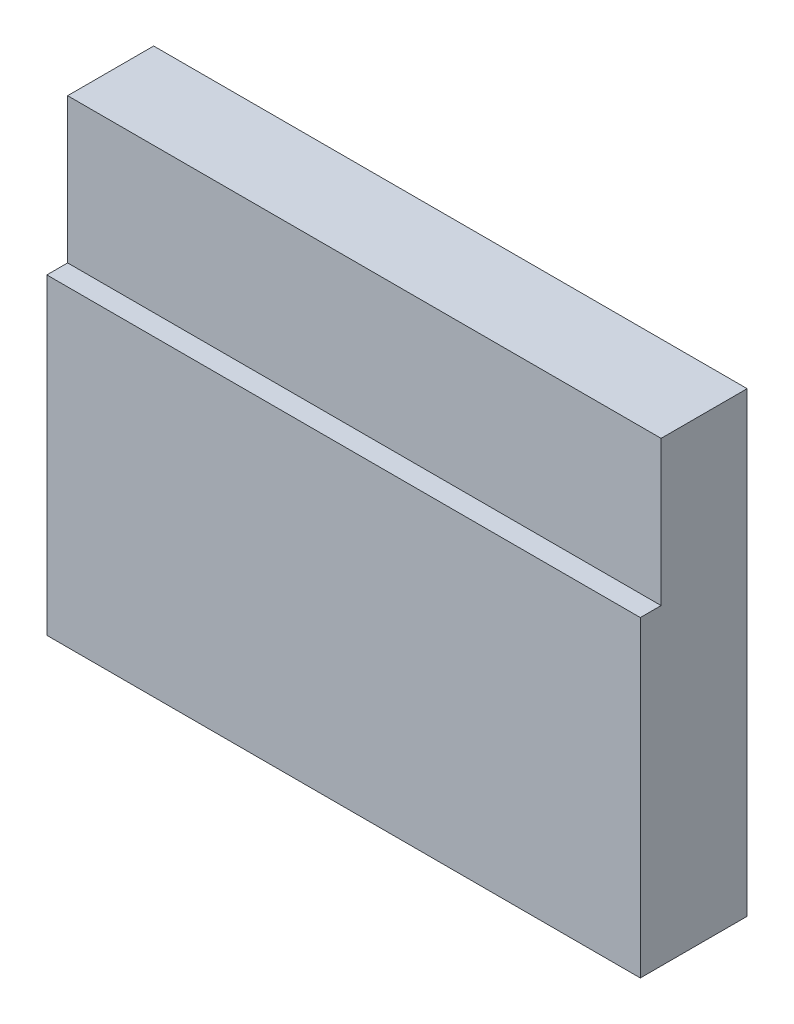
ISO-10303-21;
HEADER;
FILE_DESCRIPTION(('STEP AP214'),'2;1');
FILE_NAME('part.step','',(''),(''),'','','');
FILE_SCHEMA(('AUTOMOTIVE_DESIGN { 1 0 10303 214 1 1 1 1 }'));
ENDSEC;
DATA;
#1=APPLICATION_CONTEXT('core data for automotive mechanical design processes');
#2=APPLICATION_PROTOCOL_DEFINITION('international standard','automotive_design',2000,#1);
#3=PRODUCT_CONTEXT('',#1,'mechanical');
#4=PRODUCT('Part','Part','',(#3));
#5=PRODUCT_RELATED_PRODUCT_CATEGORY('part','',(#4));
#6=PRODUCT_DEFINITION_FORMATION('','',#4);
#7=PRODUCT_DEFINITION_CONTEXT('part definition',#1,'design');
#8=PRODUCT_DEFINITION('design','',#6,#7);
#9=PRODUCT_DEFINITION_SHAPE('','',#8);
#10=(LENGTH_UNIT() NAMED_UNIT(*) SI_UNIT(.MILLI.,.METRE.));
#11=(NAMED_UNIT(*) PLANE_ANGLE_UNIT() SI_UNIT($,.RADIAN.));
#12=(NAMED_UNIT(*) SI_UNIT($,.STERADIAN.) SOLID_ANGLE_UNIT());
#13=UNCERTAINTY_MEASURE_WITH_UNIT(LENGTH_MEASURE(1.E-05),#10,'distance_accuracy_value','');
#14=(GEOMETRIC_REPRESENTATION_CONTEXT(3) GLOBAL_UNCERTAINTY_ASSIGNED_CONTEXT((#13)) GLOBAL_UNIT_ASSIGNED_CONTEXT((#10,
#11,#12)) REPRESENTATION_CONTEXT('',''));
#15=CARTESIAN_POINT('',(0.,0.,0.));
#16=DIRECTION('',(0.,0.,1.));
#17=DIRECTION('',(1.,0.,0.));
#18=AXIS2_PLACEMENT_3D('',#15,#16,#17);
#19=CARTESIAN_POINT('',(-5.,72.,8.));
#20=DIRECTION('',(0.,-1.,0.));
#21=DIRECTION('',(0.,0.,-1.));
#22=AXIS2_PLACEMENT_3D('',#19,#20,#21);
#23=PLANE('',#22);
#24=DIRECTION('',(-1.,0.,0.));
#25=VECTOR('',#24,1.);
#26=CARTESIAN_POINT('',(-5.,72.,4.5));
#27=LINE('',#26,#25);
#28=CARTESIAN_POINT('',(95.,72.,4.5));
#29=VERTEX_POINT('',#28);
#30=CARTESIAN_POINT('',(-5.,72.,4.5));
#31=VERTEX_POINT('',#30);
#32=EDGE_CURVE('E120',#29,#31,#27,.T.);
#33=ORIENTED_EDGE('',*,*,#32,.F.);
#34=DIRECTION('',(0.,0.,-1.));
#35=VECTOR('',#34,1.);
#36=CARTESIAN_POINT('',(95.,72.,8.));
#37=LINE('',#36,#35);
#38=CARTESIAN_POINT('',(95.,72.,-10.));
#39=VERTEX_POINT('',#38);
#40=EDGE_CURVE('E87',#29,#39,#37,.T.);
#41=ORIENTED_EDGE('',*,*,#40,.T.);
#42=DIRECTION('',(-1.,0.,0.));
#43=VECTOR('',#42,1.);
#44=CARTESIAN_POINT('',(-5.,72.,-10.));
#45=LINE('',#44,#43);
#46=CARTESIAN_POINT('',(-5.,72.,-10.));
#47=VERTEX_POINT('',#46);
#48=EDGE_CURVE('E91',#39,#47,#45,.T.);
#49=ORIENTED_EDGE('',*,*,#48,.T.);
#50=DIRECTION('',(0.,0.,-1.));
#51=VECTOR('',#50,1.);
#52=CARTESIAN_POINT('',(-5.,72.,8.));
#53=LINE('',#52,#51);
#54=EDGE_CURVE('E77',#31,#47,#53,.T.);
#55=ORIENTED_EDGE('',*,*,#54,.F.);
#56=EDGE_LOOP('',(#33,#41,#49,#55));
#57=FACE_BOUND('',#56,.T.);
#58=ADVANCED_FACE('F33',(#57),#23,.F.);
#59=CARTESIAN_POINT('',(-5.,72.,8.));
#60=DIRECTION('',(1.,0.,0.));
#61=DIRECTION('',(0.,1.,0.));
#62=AXIS2_PLACEMENT_3D('',#59,#60,#61);
#63=PLANE('',#62);
#64=DIRECTION('',(0.,-1.,0.));
#65=VECTOR('',#64,1.);
#66=CARTESIAN_POINT('',(-5.,72.,8.));
#67=LINE('',#66,#65);
#68=CARTESIAN_POINT('',(-5.,47.5974722123635,8.));
#69=VERTEX_POINT('',#68);
#70=CARTESIAN_POINT('',(-4.99999999999999,-5.,8.));
#71=VERTEX_POINT('',#70);
#72=EDGE_CURVE('E96',#69,#71,#67,.T.);
#73=ORIENTED_EDGE('',*,*,#72,.F.);
#74=DIRECTION('',(0.,0.,1.));
#75=VECTOR('',#74,1.);
#76=CARTESIAN_POINT('',(-5.,47.5974722123635,4.5));
#77=LINE('',#76,#75);
#78=CARTESIAN_POINT('',(-5.,47.5974722123635,4.5));
#79=VERTEX_POINT('',#78);
#80=EDGE_CURVE('E48',#79,#69,#77,.T.);
#81=ORIENTED_EDGE('',*,*,#80,.F.);
#82=DIRECTION('',(0.,-1.,0.));
#83=VECTOR('',#82,1.);
#84=CARTESIAN_POINT('',(-5.,72.,4.5));
#85=LINE('',#84,#83);
#86=EDGE_CURVE('E84',#31,#79,#85,.T.);
#87=ORIENTED_EDGE('',*,*,#86,.F.);
#88=ORIENTED_EDGE('',*,*,#54,.T.);
#89=DIRECTION('',(0.,-1.,0.));
#90=VECTOR('',#89,1.);
#91=CARTESIAN_POINT('',(-5.,72.,-10.));
#92=LINE('',#91,#90);
#93=CARTESIAN_POINT('',(-4.99999999999999,-5.,-10.));
#94=VERTEX_POINT('',#93);
#95=EDGE_CURVE('E82',#47,#94,#92,.T.);
#96=ORIENTED_EDGE('',*,*,#95,.T.);
#97=DIRECTION('',(0.,0.,-1.));
#98=VECTOR('',#97,1.);
#99=CARTESIAN_POINT('',(-4.99999999999999,-5.,8.));
#100=LINE('',#99,#98);
#101=EDGE_CURVE('E11',#71,#94,#100,.T.);
#102=ORIENTED_EDGE('',*,*,#101,.F.);
#103=EDGE_LOOP('',(#73,#81,#87,#88,#96,#102));
#104=FACE_BOUND('',#103,.T.);
#105=ADVANCED_FACE('F35',(#104),#63,.F.);
#106=CARTESIAN_POINT('',(-4.99999999999999,-5.,8.));
#107=DIRECTION('',(0.,1.,0.));
#108=DIRECTION('',(0.,0.,1.));
#109=AXIS2_PLACEMENT_3D('',#106,#107,#108);
#110=PLANE('',#109);
#111=DIRECTION('',(1.,0.,0.));
#112=VECTOR('',#111,1.);
#113=CARTESIAN_POINT('',(-4.99999999999999,-5.,-10.));
#114=LINE('',#113,#112);
#115=CARTESIAN_POINT('',(95.,-5.,-10.));
#116=VERTEX_POINT('',#115);
#117=EDGE_CURVE('E100',#94,#116,#114,.T.);
#118=ORIENTED_EDGE('',*,*,#117,.T.);
#119=DIRECTION('',(0.,0.,-1.));
#120=VECTOR('',#119,1.);
#121=CARTESIAN_POINT('',(95.,-5.,8.));
#122=LINE('',#121,#120);
#123=CARTESIAN_POINT('',(95.,-5.,8.));
#124=VERTEX_POINT('',#123);
#125=EDGE_CURVE('E41',#124,#116,#122,.T.);
#126=ORIENTED_EDGE('',*,*,#125,.F.);
#127=DIRECTION('',(1.,0.,0.));
#128=VECTOR('',#127,1.);
#129=CARTESIAN_POINT('',(-4.99999999999999,-5.,8.));
#130=LINE('',#129,#128);
#131=EDGE_CURVE('E57',#71,#124,#130,.T.);
#132=ORIENTED_EDGE('',*,*,#131,.F.);
#133=ORIENTED_EDGE('',*,*,#101,.T.);
#134=EDGE_LOOP('',(#118,#126,#132,#133));
#135=FACE_BOUND('',#134,.T.);
#136=ADVANCED_FACE('F116',(#135),#110,.F.);
#137=CARTESIAN_POINT('',(95.,72.,8.));
#138=DIRECTION('',(-1.,0.,0.));
#139=DIRECTION('',(0.,-1.,0.));
#140=AXIS2_PLACEMENT_3D('',#137,#138,#139);
#141=PLANE('',#140);
#142=DIRECTION('',(0.,1.,0.));
#143=VECTOR('',#142,1.);
#144=CARTESIAN_POINT('',(95.,72.,4.5));
#145=LINE('',#144,#143);
#146=CARTESIAN_POINT('',(95.,47.5974722123635,4.5));
#147=VERTEX_POINT('',#146);
#148=EDGE_CURVE('E126',#147,#29,#145,.T.);
#149=ORIENTED_EDGE('',*,*,#148,.F.);
#150=DIRECTION('',(0.,0.,1.));
#151=VECTOR('',#150,1.);
#152=CARTESIAN_POINT('',(95.,47.5974722123635,4.5));
#153=LINE('',#152,#151);
#154=CARTESIAN_POINT('',(95.,47.5974722123635,8.));
#155=VERTEX_POINT('',#154);
#156=EDGE_CURVE('E101',#147,#155,#153,.T.);
#157=ORIENTED_EDGE('',*,*,#156,.T.);
#158=DIRECTION('',(0.,1.,0.));
#159=VECTOR('',#158,1.);
#160=CARTESIAN_POINT('',(95.,72.,8.));
#161=LINE('',#160,#159);
#162=EDGE_CURVE('E88',#124,#155,#161,.T.);
#163=ORIENTED_EDGE('',*,*,#162,.F.);
#164=ORIENTED_EDGE('',*,*,#125,.T.);
#165=DIRECTION('',(0.,1.,0.));
#166=VECTOR('',#165,1.);
#167=CARTESIAN_POINT('',(95.,72.,-10.));
#168=LINE('',#167,#166);
#169=EDGE_CURVE('E97',#116,#39,#168,.T.);
#170=ORIENTED_EDGE('',*,*,#169,.T.);
#171=ORIENTED_EDGE('',*,*,#40,.F.);
#172=EDGE_LOOP('',(#149,#157,#163,#164,#170,#171));
#173=FACE_BOUND('',#172,.T.);
#174=ADVANCED_FACE('F114',(#173),#141,.F.);
#175=CARTESIAN_POINT('',(0.,0.,8.));
#176=DIRECTION('',(0.,0.,1.));
#177=DIRECTION('',(1.,0.,0.));
#178=AXIS2_PLACEMENT_3D('',#175,#176,#177);
#179=PLANE('',#178);
#180=DIRECTION('',(1.,0.,0.));
#181=VECTOR('',#180,1.);
#182=CARTESIAN_POINT('',(-5.,47.5974722123635,8.));
#183=LINE('',#182,#181);
#184=EDGE_CURVE('E122',#69,#155,#183,.T.);
#185=ORIENTED_EDGE('',*,*,#184,.F.);
#186=ORIENTED_EDGE('',*,*,#72,.T.);
#187=ORIENTED_EDGE('',*,*,#131,.T.);
#188=ORIENTED_EDGE('',*,*,#162,.T.);
#189=EDGE_LOOP('',(#185,#186,#187,#188));
#190=FACE_BOUND('',#189,.T.);
#191=ADVANCED_FACE('F142',(#190),#179,.T.);
#192=CARTESIAN_POINT('',(0.,0.,-10.));
#193=DIRECTION('',(0.,0.,1.));
#194=DIRECTION('',(1.,0.,0.));
#195=AXIS2_PLACEMENT_3D('',#192,#193,#194);
#196=PLANE('',#195);
#197=ORIENTED_EDGE('',*,*,#95,.F.);
#198=ORIENTED_EDGE('',*,*,#48,.F.);
#199=ORIENTED_EDGE('',*,*,#169,.F.);
#200=ORIENTED_EDGE('',*,*,#117,.F.);
#201=EDGE_LOOP('',(#197,#198,#199,#200));
#202=FACE_BOUND('',#201,.T.);
#203=ADVANCED_FACE('F99',(#202),#196,.F.);
#204=CARTESIAN_POINT('',(-5.,47.5974722123635,4.5));
#205=DIRECTION('',(0.,-1.,0.));
#206=DIRECTION('',(0.,0.,-1.));
#207=AXIS2_PLACEMENT_3D('',#204,#205,#206);
#208=PLANE('',#207);
#209=ORIENTED_EDGE('',*,*,#184,.T.);
#210=ORIENTED_EDGE('',*,*,#156,.F.);
#211=DIRECTION('',(1.,0.,0.));
#212=VECTOR('',#211,1.);
#213=CARTESIAN_POINT('',(-5.,47.5974722123635,4.5));
#214=LINE('',#213,#212);
#215=EDGE_CURVE('E129',#79,#147,#214,.T.);
#216=ORIENTED_EDGE('',*,*,#215,.F.);
#217=ORIENTED_EDGE('',*,*,#80,.T.);
#218=EDGE_LOOP('',(#209,#210,#216,#217));
#219=FACE_BOUND('',#218,.T.);
#220=ADVANCED_FACE('F143',(#219),#208,.F.);
#221=CARTESIAN_POINT('',(0.,0.,4.5));
#222=DIRECTION('',(0.,0.,1.));
#223=DIRECTION('',(1.,0.,0.));
#224=AXIS2_PLACEMENT_3D('',#221,#222,#223);
#225=PLANE('',#224);
#226=ORIENTED_EDGE('',*,*,#86,.T.);
#227=ORIENTED_EDGE('',*,*,#215,.T.);
#228=ORIENTED_EDGE('',*,*,#148,.T.);
#229=ORIENTED_EDGE('',*,*,#32,.T.);
#230=EDGE_LOOP('',(#226,#227,#228,#229));
#231=FACE_BOUND('',#230,.T.);
#232=ADVANCED_FACE('F133',(#231),#225,.T.);
#233=CLOSED_SHELL('',(#58,#105,#136,#174,#191,#203,#220,#232));
#234=MANIFOLD_SOLID_BREP('B2',#233);
#235=ADVANCED_BREP_SHAPE_REPRESENTATION('',(#18,#234),#14);
#236=SHAPE_DEFINITION_REPRESENTATION(#9,#235);
ENDSEC;
END-ISO-10303-21;
